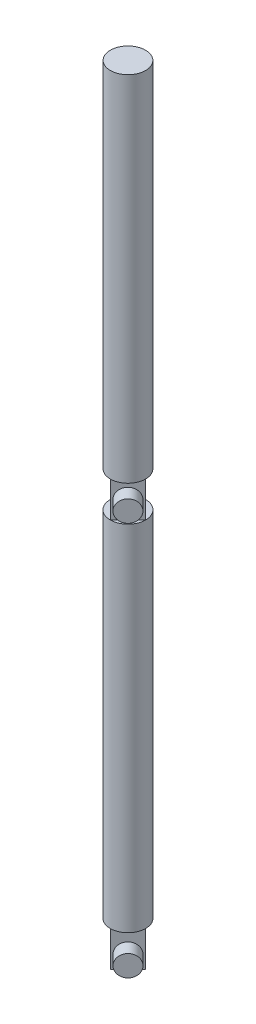
ISO-10303-21;
HEADER;
FILE_DESCRIPTION(('STEP AP214'),'2;1');
FILE_NAME('part.step','',(''),(''),'','','');
FILE_SCHEMA(('AUTOMOTIVE_DESIGN { 1 0 10303 214 1 1 1 1 }'));
ENDSEC;
DATA;
#1=APPLICATION_CONTEXT('core data for automotive mechanical design processes');
#2=APPLICATION_PROTOCOL_DEFINITION('international standard','automotive_design',2000,#1);
#3=PRODUCT_CONTEXT('',#1,'mechanical');
#4=PRODUCT('Part','Part','',(#3));
#5=PRODUCT_RELATED_PRODUCT_CATEGORY('part','',(#4));
#6=PRODUCT_DEFINITION_FORMATION('','',#4);
#7=PRODUCT_DEFINITION_CONTEXT('part definition',#1,'design');
#8=PRODUCT_DEFINITION('design','',#6,#7);
#9=PRODUCT_DEFINITION_SHAPE('','',#8);
#10=(LENGTH_UNIT() NAMED_UNIT(*) SI_UNIT(.MILLI.,.METRE.));
#11=(NAMED_UNIT(*) PLANE_ANGLE_UNIT() SI_UNIT($,.RADIAN.));
#12=(NAMED_UNIT(*) SI_UNIT($,.STERADIAN.) SOLID_ANGLE_UNIT());
#13=UNCERTAINTY_MEASURE_WITH_UNIT(LENGTH_MEASURE(1.E-05),#10,'distance_accuracy_value','');
#14=(GEOMETRIC_REPRESENTATION_CONTEXT(3) GLOBAL_UNCERTAINTY_ASSIGNED_CONTEXT((#13)) GLOBAL_UNIT_ASSIGNED_CONTEXT((#10,
#11,#12)) REPRESENTATION_CONTEXT('',''));
#15=CARTESIAN_POINT('',(0.,0.,0.));
#16=DIRECTION('',(0.,0.,1.));
#17=DIRECTION('',(1.,0.,0.));
#18=AXIS2_PLACEMENT_3D('',#15,#16,#17);
#19=CARTESIAN_POINT('',(0.,550.,0.));
#20=DIRECTION('',(0.,-1.,0.));
#21=DIRECTION('',(0.,0.,-1.));
#22=AXIS2_PLACEMENT_3D('',#19,#20,#21);
#23=PLANE('',#22);
#24=CARTESIAN_POINT('',(-21.9966057856953,550.,-2.2230612230224));
#25=DIRECTION('',(0.,1.,0.));
#26=DIRECTION('',(0.,0.,1.));
#27=AXIS2_PLACEMENT_3D('',#24,#25,#26);
#28=CIRCLE('',#27,24.8782014848427);
#29=CARTESIAN_POINT('',(2.88129607852289,550.,-2.10096308724056));
#30=VERTEX_POINT('',#29);
#31=CARTESIAN_POINT('',(2.88159534252092,550.,-2.22727363961716));
#32=VERTEX_POINT('',#31);
#33=EDGE_CURVE('E11',#30,#32,#28,.T.);
#34=ORIENTED_EDGE('',*,*,#33,.F.);
#35=DIRECTION('',(0.707106781186547,0.,-0.707106781186547));
#36=VECTOR('',#35,1.);
#37=CARTESIAN_POINT('',(-21.9966057856953,550.,22.7769387769776));
#38=LINE('',#37,#36);
#39=CARTESIAN_POINT('',(2.94460098671021,550.,-2.16426799542787));
#40=VERTEX_POINT('',#39);
#41=EDGE_CURVE('E156',#30,#40,#38,.T.);
#42=ORIENTED_EDGE('',*,*,#41,.T.);
#43=DIRECTION('',(-0.707106781186547,0.,-0.707106781186547));
#44=VECTOR('',#43,1.);
#45=CARTESIAN_POINT('',(-22.0553990132898,550.,-27.1642679954279));
#46=LINE('',#45,#44);
#47=EDGE_CURVE('E203',#40,#32,#46,.T.);
#48=ORIENTED_EDGE('',*,*,#47,.T.);
#49=EDGE_LOOP('',(#34,#42,#48));
#50=FACE_BOUND('',#49,.T.);
#51=ADVANCED_FACE('F39',(#50),#23,.F.);
#52=CARTESIAN_POINT('',(-21.9923933691005,550.,-27.1012623512386));
#53=VERTEX_POINT('',#52);
#54=CARTESIAN_POINT('',(-22.1187039214771,550.,-27.1009630872406));
#55=VERTEX_POINT('',#54);
#56=EDGE_CURVE('E48',#53,#55,#28,.T.);
#57=ORIENTED_EDGE('',*,*,#56,.F.);
#58=CARTESIAN_POINT('',(-22.0553990132898,550.,-27.1642679954279));
#59=VERTEX_POINT('',#58);
#60=EDGE_CURVE('E153',#53,#59,#46,.T.);
#61=ORIENTED_EDGE('',*,*,#60,.T.);
#62=DIRECTION('',(-0.707106781186547,0.,0.707106781186547));
#63=VECTOR('',#62,1.);
#64=CARTESIAN_POINT('',(-46.9966057856953,550.,-2.2230612230224));
#65=LINE('',#64,#63);
#66=EDGE_CURVE('E191',#59,#55,#65,.T.);
#67=ORIENTED_EDGE('',*,*,#66,.T.);
#68=EDGE_LOOP('',(#57,#61,#67));
#69=FACE_BOUND('',#68,.T.);
#70=ADVANCED_FACE('F342',(#69),#23,.F.);
#71=CARTESIAN_POINT('',(-46.8745076499134,550.,-2.34515935880425));
#72=VERTEX_POINT('',#71);
#73=CARTESIAN_POINT('',(-46.8745076499134,550.,-2.10096308724056));
#74=VERTEX_POINT('',#73);
#75=EDGE_CURVE('E172',#72,#74,#28,.T.);
#76=ORIENTED_EDGE('',*,*,#75,.F.);
#77=CARTESIAN_POINT('',(-46.9966057856953,550.,-2.2230612230224));
#78=VERTEX_POINT('',#77);
#79=EDGE_CURVE('E192',#72,#78,#65,.T.);
#80=ORIENTED_EDGE('',*,*,#79,.T.);
#81=DIRECTION('',(0.707106781186547,0.,0.707106781186547));
#82=VECTOR('',#81,1.);
#83=CARTESIAN_POINT('',(-46.9966057856953,550.,-2.2230612230224));
#84=LINE('',#83,#82);
#85=EDGE_CURVE('E199',#78,#74,#84,.T.);
#86=ORIENTED_EDGE('',*,*,#85,.T.);
#87=EDGE_LOOP('',(#76,#80,#86));
#88=FACE_BOUND('',#87,.T.);
#89=ADVANCED_FACE('F349',(#88),#23,.F.);
#90=CARTESIAN_POINT('',(-21.9966057856953,0.,-2.2230612230224));
#91=DIRECTION('',(0.,1.,0.));
#92=DIRECTION('',(0.,0.,1.));
#93=AXIS2_PLACEMENT_3D('',#90,#91,#92);
#94=PLANE('',#93);
#95=DIRECTION('',(-0.707106781186547,0.,0.707106781186548));
#96=VECTOR('',#95,1.);
#97=CARTESIAN_POINT('',(-21.9896594794857,0.,22.7838850831871));
#98=LINE('',#97,#96);
#99=CARTESIAN_POINT('',(3.00339035206428,0.,-2.20916474836285));
#100=VERTEX_POINT('',#99);
#101=CARTESIAN_POINT('',(-21.9827093110357,0.,22.7769349147371));
#102=VERTEX_POINT('',#101);
#103=EDGE_CURVE('E173',#100,#102,#98,.T.);
#104=ORIENTED_EDGE('',*,*,#103,.F.);
#105=CARTESIAN_POINT('',(-21.9966057856953,0.,-2.2230612230224));
#106=DIRECTION('',(0.,1.,0.));
#107=DIRECTION('',(0.,0.,1.));
#108=AXIS2_PLACEMENT_3D('',#105,#106,#107);
#109=CIRCLE('',#108,25.);
#110=EDGE_CURVE('E234',#102,#100,#109,.T.);
#111=ORIENTED_EDGE('',*,*,#110,.F.);
#112=EDGE_LOOP('',(#104,#111));
#113=FACE_BOUND('',#112,.T.);
#114=ADVANCED_FACE('F339',(#113),#94,.F.);
#115=DIRECTION('',(-0.707106781186548,0.,-0.707106781186547));
#116=VECTOR('',#115,1.);
#117=CARTESIAN_POINT('',(-46.9966057856953,0.,-2.22306122302241));
#118=LINE('',#117,#116);
#119=CARTESIAN_POINT('',(-21.9966057856952,0.,22.7769387769776));
#120=VERTEX_POINT('',#119);
#121=CARTESIAN_POINT('',(-46.9966057856953,0.,-2.22306122302239));
#122=VERTEX_POINT('',#121);
#123=EDGE_CURVE('E230',#120,#122,#118,.T.);
#124=ORIENTED_EDGE('',*,*,#123,.F.);
#125=EDGE_CURVE('E226',#122,#120,#109,.T.);
#126=ORIENTED_EDGE('',*,*,#125,.F.);
#127=EDGE_LOOP('',(#124,#126));
#128=FACE_BOUND('',#127,.T.);
#129=ADVANCED_FACE('F332',(#128),#94,.F.);
#130=DIRECTION('',(0.707106781186548,0.,0.707106781186547));
#131=VECTOR('',#130,1.);
#132=CARTESIAN_POINT('',(-21.9966057856953,0.,-27.2230612230224));
#133=LINE('',#132,#131);
#134=CARTESIAN_POINT('',(-21.9966057856953,0.,-27.2230612230224));
#135=VERTEX_POINT('',#134);
#136=CARTESIAN_POINT('',(3.00339421430474,0.,-2.22306122302241));
#137=VERTEX_POINT('',#136);
#138=EDGE_CURVE('E276',#135,#137,#133,.T.);
#139=ORIENTED_EDGE('',*,*,#138,.F.);
#140=EDGE_CURVE('E319',#137,#135,#109,.T.);
#141=ORIENTED_EDGE('',*,*,#140,.F.);
#142=EDGE_LOOP('',(#139,#141));
#143=FACE_BOUND('',#142,.T.);
#144=ADVANCED_FACE('F329',(#143),#94,.F.);
#145=DIRECTION('',(0.707106781186547,0.,-0.707106781186548));
#146=VECTOR('',#145,1.);
#147=CARTESIAN_POINT('',(-46.9966057856953,0.,-2.22306122302241));
#148=LINE('',#147,#146);
#149=EDGE_CURVE('E272',#122,#135,#148,.T.);
#150=ORIENTED_EDGE('',*,*,#149,.F.);
#151=EDGE_CURVE('E318',#135,#122,#109,.T.);
#152=ORIENTED_EDGE('',*,*,#151,.F.);
#153=EDGE_LOOP('',(#150,#152));
#154=FACE_BOUND('',#153,.T.);
#155=ADVANCED_FACE('F331',(#154),#94,.F.);
#156=CARTESIAN_POINT('',(-21.9966057856953,500.,-2.2230612230224));
#157=DIRECTION('',(0.,1.,0.));
#158=DIRECTION('',(0.,0.,1.));
#159=AXIS2_PLACEMENT_3D('',#156,#157,#158);
#160=PLANE('',#159);
#161=DIRECTION('',(-0.707106781186547,0.,0.707106781186547));
#162=VECTOR('',#161,1.);
#163=CARTESIAN_POINT('',(-46.9966057856953,500.,-2.2230612230224));
#164=LINE('',#163,#162);
#165=CARTESIAN_POINT('',(-22.0553990132898,500.,-27.1642679954279));
#166=VERTEX_POINT('',#165);
#167=CARTESIAN_POINT('',(-46.9966057856953,500.,-2.22306122302241));
#168=VERTEX_POINT('',#167);
#169=EDGE_CURVE('E206',#166,#168,#164,.T.);
#170=ORIENTED_EDGE('',*,*,#169,.F.);
#171=DIRECTION('',(-0.707106781186547,0.,-0.707106781186547));
#172=VECTOR('',#171,1.);
#173=CARTESIAN_POINT('',(-22.0553990132898,500.,-27.1642679954279));
#174=LINE('',#173,#172);
#175=CARTESIAN_POINT('',(2.94460098671021,500.,-2.16426799542787));
#176=VERTEX_POINT('',#175);
#177=EDGE_CURVE('E194',#176,#166,#174,.T.);
#178=ORIENTED_EDGE('',*,*,#177,.F.);
#179=DIRECTION('',(0.707106781186547,0.,-0.707106781186547));
#180=VECTOR('',#179,1.);
#181=CARTESIAN_POINT('',(-21.9966057856953,500.,22.7769387769776));
#182=LINE('',#181,#180);
#183=CARTESIAN_POINT('',(-21.9966057856953,500.,22.7769387769776));
#184=VERTEX_POINT('',#183);
#185=EDGE_CURVE('E212',#184,#176,#182,.T.);
#186=ORIENTED_EDGE('',*,*,#185,.F.);
#187=CARTESIAN_POINT('',(-21.9966057856953,500.,-2.2230612230224));
#188=DIRECTION('',(0.,1.,0.));
#189=DIRECTION('',(0.,0.,1.));
#190=AXIS2_PLACEMENT_3D('',#187,#188,#189);
#191=CIRCLE('',#190,25.);
#192=EDGE_CURVE('E227',#184,#168,#191,.T.);
#193=ORIENTED_EDGE('',*,*,#192,.T.);
#194=EDGE_LOOP('',(#170,#178,#186,#193));
#195=FACE_BOUND('',#194,.T.);
#196=ADVANCED_FACE('F337',(#195),#160,.T.);
#197=CARTESIAN_POINT('',(-21.9966057856953,500.,-2.2230612230224));
#198=DIRECTION('',(0.,-1.,0.));
#199=DIRECTION('',(0.,0.,-1.));
#200=AXIS2_PLACEMENT_3D('',#197,#198,#199);
#201=CYLINDRICAL_SURFACE('',#200,25.);
#202=ORIENTED_EDGE('',*,*,#192,.F.);
#203=EDGE_CURVE('E231',#168,#184,#191,.T.);
#204=ORIENTED_EDGE('',*,*,#203,.F.);
#205=EDGE_LOOP('',(#202,#204));
#206=FACE_BOUND('',#205,.T.);
#207=EDGE_CURVE('E232',#120,#102,#109,.T.);
#208=ORIENTED_EDGE('',*,*,#207,.T.);
#209=ORIENTED_EDGE('',*,*,#110,.T.);
#210=EDGE_CURVE('E320',#100,#137,#109,.T.);
#211=ORIENTED_EDGE('',*,*,#210,.T.);
#212=ORIENTED_EDGE('',*,*,#140,.T.);
#213=ORIENTED_EDGE('',*,*,#151,.T.);
#214=ORIENTED_EDGE('',*,*,#125,.T.);
#215=EDGE_LOOP('',(#208,#209,#211,#212,#213,#214));
#216=FACE_BOUND('',#215,.T.);
#217=ADVANCED_FACE('F41',(#206,#216),#201,.T.);
#218=DIRECTION('',(0.707106781186547,0.,0.707106781186547));
#219=VECTOR('',#218,1.);
#220=CARTESIAN_POINT('',(-46.9966057856953,500.,-2.2230612230224));
#221=LINE('',#220,#219);
#222=EDGE_CURVE('E209',#168,#184,#221,.T.);
#223=ORIENTED_EDGE('',*,*,#222,.F.);
#224=ORIENTED_EDGE('',*,*,#203,.T.);
#225=EDGE_LOOP('',(#223,#224));
#226=FACE_BOUND('',#225,.T.);
#227=ADVANCED_FACE('F439',(#226),#160,.T.);
#228=CARTESIAN_POINT('',(-46.9966057856953,550.,-2.2230612230224));
#229=DIRECTION('',(0.707106781186547,0.,0.707106781186547));
#230=DIRECTION('',(0.707106781186548,0.,-0.707106781186548));
#231=AXIS2_PLACEMENT_3D('',#228,#229,#230);
#232=PLANE('',#231);
#233=CARTESIAN_POINT('',(-34.5260023994925,525.,-14.6936646092251));
#234=DIRECTION('',(0.707106781186547,0.,0.707106781186547));
#235=DIRECTION('',(0.707106781186548,0.,-0.707106781186548));
#236=AXIS2_PLACEMENT_3D('',#233,#234,#235);
#237=CIRCLE('',#236,15.);
#238=CARTESIAN_POINT('',(-23.9194006816943,525.,-25.3002663270233));
#239=VERTEX_POINT('',#238);
#240=EDGE_CURVE('E255',#239,#239,#237,.T.);
#241=ORIENTED_EDGE('',*,*,#240,.T.);
#242=EDGE_LOOP('',(#241));
#243=FACE_BOUND('',#242,.T.);
#244=ORIENTED_EDGE('',*,*,#169,.T.);
#245=DIRECTION('',(0.,-1.,0.));
#246=VECTOR('',#245,1.);
#247=CARTESIAN_POINT('',(-46.9966057856953,550.,-2.2230612230224));
#248=LINE('',#247,#246);
#249=EDGE_CURVE('E223',#78,#168,#248,.T.);
#250=ORIENTED_EDGE('',*,*,#249,.F.);
#251=ORIENTED_EDGE('',*,*,#79,.F.);
#252=EDGE_CURVE('E187',#55,#72,#65,.T.);
#253=ORIENTED_EDGE('',*,*,#252,.F.);
#254=ORIENTED_EDGE('',*,*,#66,.F.);
#255=DIRECTION('',(0.,-1.,0.));
#256=VECTOR('',#255,1.);
#257=CARTESIAN_POINT('',(-22.0553990132898,550.,-27.1642679954279));
#258=LINE('',#257,#256);
#259=EDGE_CURVE('E205',#59,#166,#258,.T.);
#260=ORIENTED_EDGE('',*,*,#259,.T.);
#261=EDGE_LOOP('',(#244,#250,#251,#253,#254,#260));
#262=FACE_BOUND('',#261,.T.);
#263=ADVANCED_FACE('F369',(#243,#262),#232,.F.);
#264=CARTESIAN_POINT('',(-46.9966057856953,550.,-2.2230612230224));
#265=DIRECTION('',(0.707106781186547,0.,-0.707106781186547));
#266=DIRECTION('',(-0.707106781186548,0.,-0.707106781186548));
#267=AXIS2_PLACEMENT_3D('',#264,#265,#266);
#268=PLANE('',#267);
#269=ORIENTED_EDGE('',*,*,#222,.T.);
#270=DIRECTION('',(0.,-1.,0.));
#271=VECTOR('',#270,1.);
#272=CARTESIAN_POINT('',(-21.9966057856953,550.,22.7769387769776));
#273=LINE('',#272,#271);
#274=CARTESIAN_POINT('',(-21.9966057856953,550.,22.7769387769776));
#275=VERTEX_POINT('',#274);
#276=EDGE_CURVE('E221',#275,#184,#273,.T.);
#277=ORIENTED_EDGE('',*,*,#276,.F.);
#278=CARTESIAN_POINT('',(-22.1187039214771,550.,22.6548406411957));
#279=VERTEX_POINT('',#278);
#280=EDGE_CURVE('E149',#279,#275,#84,.T.);
#281=ORIENTED_EDGE('',*,*,#280,.F.);
#282=EDGE_CURVE('E201',#74,#279,#84,.T.);
#283=ORIENTED_EDGE('',*,*,#282,.F.);
#284=ORIENTED_EDGE('',*,*,#85,.F.);
#285=ORIENTED_EDGE('',*,*,#249,.T.);
#286=EDGE_LOOP('',(#269,#277,#281,#283,#284,#285));
#287=FACE_BOUND('',#286,.T.);
#288=ADVANCED_FACE('F371',(#287),#268,.F.);
#289=CARTESIAN_POINT('',(-21.9966057856953,550.,22.7769387769776));
#290=DIRECTION('',(-0.707106781186547,0.,-0.707106781186547));
#291=DIRECTION('',(-0.707106781186548,0.,0.707106781186548));
#292=AXIS2_PLACEMENT_3D('',#289,#290,#291);
#293=PLANE('',#292);
#294=CARTESIAN_POINT('',(-9.52600239949253,525.,10.3063353907749));
#295=DIRECTION('',(-0.707106781186547,0.,-0.707106781186547));
#296=DIRECTION('',(-0.707106781186548,0.,0.707106781186548));
#297=AXIS2_PLACEMENT_3D('',#294,#295,#296);
#298=CIRCLE('',#297,15.);
#299=CARTESIAN_POINT('',(-20.1326041172907,525.,20.9129371085731));
#300=VERTEX_POINT('',#299);
#301=EDGE_CURVE('E43',#300,#300,#298,.T.);
#302=ORIENTED_EDGE('',*,*,#301,.T.);
#303=EDGE_LOOP('',(#302));
#304=FACE_BOUND('',#303,.T.);
#305=ORIENTED_EDGE('',*,*,#185,.T.);
#306=DIRECTION('',(0.,-1.,0.));
#307=VECTOR('',#306,1.);
#308=CARTESIAN_POINT('',(2.94460098671021,550.,-2.16426799542787));
#309=LINE('',#308,#307);
#310=EDGE_CURVE('E218',#40,#176,#309,.T.);
#311=ORIENTED_EDGE('',*,*,#310,.F.);
#312=ORIENTED_EDGE('',*,*,#41,.F.);
#313=CARTESIAN_POINT('',(-21.8745076499134,550.,22.6548406411957));
#314=VERTEX_POINT('',#313);
#315=EDGE_CURVE('E154',#314,#30,#38,.T.);
#316=ORIENTED_EDGE('',*,*,#315,.F.);
#317=EDGE_CURVE('E143',#275,#314,#38,.T.);
#318=ORIENTED_EDGE('',*,*,#317,.F.);
#319=ORIENTED_EDGE('',*,*,#276,.T.);
#320=EDGE_LOOP('',(#305,#311,#312,#316,#318,#319));
#321=FACE_BOUND('',#320,.T.);
#322=ADVANCED_FACE('F160',(#304,#321),#293,.F.);
#323=CARTESIAN_POINT('',(-22.0553990132898,550.,-27.1642679954279));
#324=DIRECTION('',(-0.707106781186547,0.,0.707106781186547));
#325=DIRECTION('',(0.707106781186548,0.,0.707106781186548));
#326=AXIS2_PLACEMENT_3D('',#323,#324,#325);
#327=PLANE('',#326);
#328=ORIENTED_EDGE('',*,*,#177,.T.);
#329=ORIENTED_EDGE('',*,*,#259,.F.);
#330=ORIENTED_EDGE('',*,*,#60,.F.);
#331=EDGE_CURVE('E63',#32,#53,#46,.T.);
#332=ORIENTED_EDGE('',*,*,#331,.F.);
#333=ORIENTED_EDGE('',*,*,#47,.F.);
#334=ORIENTED_EDGE('',*,*,#310,.T.);
#335=EDGE_LOOP('',(#328,#329,#330,#332,#333,#334));
#336=FACE_BOUND('',#335,.T.);
#337=ADVANCED_FACE('F353',(#336),#327,.F.);
#338=EDGE_CURVE('E147',#279,#314,#28,.T.);
#339=ORIENTED_EDGE('',*,*,#338,.F.);
#340=ORIENTED_EDGE('',*,*,#280,.T.);
#341=ORIENTED_EDGE('',*,*,#317,.T.);
#342=EDGE_LOOP('',(#339,#340,#341));
#343=FACE_BOUND('',#342,.T.);
#344=ADVANCED_FACE('F145',(#343),#23,.F.);
#345=CARTESIAN_POINT('',(0.,0.,0.));
#346=DIRECTION('',(0.,1.,0.));
#347=DIRECTION('',(0.,0.,1.));
#348=AXIS2_PLACEMENT_3D('',#345,#346,#347);
#349=PLANE('',#348);
#350=ORIENTED_EDGE('',*,*,#207,.F.);
#351=CARTESIAN_POINT('',(-21.9896594794857,0.,22.7838850831871));
#352=VERTEX_POINT('',#351);
#353=EDGE_CURVE('E258',#352,#120,#118,.T.);
#354=ORIENTED_EDGE('',*,*,#353,.F.);
#355=EDGE_CURVE('E279',#102,#352,#98,.T.);
#356=ORIENTED_EDGE('',*,*,#355,.F.);
#357=EDGE_LOOP('',(#350,#354,#356));
#358=FACE_BOUND('',#357,.T.);
#359=ADVANCED_FACE('F311',(#358),#349,.T.);
#360=ORIENTED_EDGE('',*,*,#210,.F.);
#361=CARTESIAN_POINT('',(3.0103405205143,0.,-2.21611491681286));
#362=VERTEX_POINT('',#361);
#363=EDGE_CURVE('E263',#362,#100,#98,.T.);
#364=ORIENTED_EDGE('',*,*,#363,.F.);
#365=EDGE_CURVE('E275',#137,#362,#133,.T.);
#366=ORIENTED_EDGE('',*,*,#365,.F.);
#367=EDGE_LOOP('',(#360,#364,#366));
#368=FACE_BOUND('',#367,.T.);
#369=ADVANCED_FACE('F324',(#368),#349,.T.);
#370=CARTESIAN_POINT('',(-46.9966057856953,-50.,-2.22306122302241));
#371=DIRECTION('',(0.707106781186547,0.,-0.707106781186548));
#372=DIRECTION('',(-0.707106781186548,0.,-0.707106781186547));
#373=AXIS2_PLACEMENT_3D('',#370,#371,#372);
#374=PLANE('',#373);
#375=ORIENTED_EDGE('',*,*,#353,.T.);
#376=ORIENTED_EDGE('',*,*,#123,.T.);
#377=DIRECTION('',(0.,1.,0.));
#378=VECTOR('',#377,1.);
#379=CARTESIAN_POINT('',(-46.9966057856953,-50.,-2.22306122302241));
#380=LINE('',#379,#378);
#381=CARTESIAN_POINT('',(-46.9966057856953,-50.,-2.22306122302241));
#382=VERTEX_POINT('',#381);
#383=EDGE_CURVE('E197',#382,#122,#380,.T.);
#384=ORIENTED_EDGE('',*,*,#383,.F.);
#385=DIRECTION('',(-0.707106781186548,0.,-0.707106781186547));
#386=VECTOR('',#385,1.);
#387=CARTESIAN_POINT('',(-46.9966057856953,-50.,-2.22306122302241));
#388=LINE('',#387,#386);
#389=CARTESIAN_POINT('',(-21.9896594794857,-50.,22.7838850831871));
#390=VERTEX_POINT('',#389);
#391=EDGE_CURVE('E259',#390,#382,#388,.T.);
#392=ORIENTED_EDGE('',*,*,#391,.F.);
#393=DIRECTION('',(0.,1.,0.));
#394=VECTOR('',#393,1.);
#395=CARTESIAN_POINT('',(-21.9896594794857,-50.,22.7838850831871));
#396=LINE('',#395,#394);
#397=EDGE_CURVE('E269',#390,#352,#396,.T.);
#398=ORIENTED_EDGE('',*,*,#397,.T.);
#399=EDGE_LOOP('',(#375,#376,#384,#392,#398));
#400=FACE_BOUND('',#399,.T.);
#401=ADVANCED_FACE('F298',(#400),#374,.F.);
#402=CARTESIAN_POINT('',(-46.9966057856953,-50.,-2.22306122302241));
#403=DIRECTION('',(0.707106781186548,0.,0.707106781186547));
#404=DIRECTION('',(0.707106781186547,0.,-0.707106781186548));
#405=AXIS2_PLACEMENT_3D('',#402,#403,#404);
#406=PLANE('',#405);
#407=CARTESIAN_POINT('',(-34.4962637160924,-31.3999984105153,-14.7234032926253));
#408=DIRECTION('',(0.707106781186548,0.,0.707106781186547));
#409=DIRECTION('',(0.707106781186547,0.,-0.707106781186548));
#410=AXIS2_PLACEMENT_3D('',#407,#408,#409);
#411=CIRCLE('',#410,15.);
#412=CARTESIAN_POINT('',(-23.8896619982942,-31.3999984105153,-25.3300050104235));
#413=VERTEX_POINT('',#412);
#414=EDGE_CURVE('E237',#413,#413,#411,.T.);
#415=ORIENTED_EDGE('',*,*,#414,.T.);
#416=EDGE_LOOP('',(#415));
#417=FACE_BOUND('',#416,.T.);
#418=ORIENTED_EDGE('',*,*,#149,.T.);
#419=DIRECTION('',(0.,1.,0.));
#420=VECTOR('',#419,1.);
#421=CARTESIAN_POINT('',(-21.9966057856953,-50.,-27.2230612230224));
#422=LINE('',#421,#420);
#423=CARTESIAN_POINT('',(-21.9966057856953,-50.,-27.2230612230224));
#424=VERTEX_POINT('',#423);
#425=EDGE_CURVE('E286',#424,#135,#422,.T.);
#426=ORIENTED_EDGE('',*,*,#425,.F.);
#427=DIRECTION('',(0.707106781186547,0.,-0.707106781186548));
#428=VECTOR('',#427,1.);
#429=CARTESIAN_POINT('',(-46.9966057856953,-50.,-2.22306122302241));
#430=LINE('',#429,#428);
#431=EDGE_CURVE('E262',#382,#424,#430,.T.);
#432=ORIENTED_EDGE('',*,*,#431,.F.);
#433=ORIENTED_EDGE('',*,*,#383,.T.);
#434=EDGE_LOOP('',(#418,#426,#432,#433));
#435=FACE_BOUND('',#434,.T.);
#436=ADVANCED_FACE('F294',(#417,#435),#406,.F.);
#437=CARTESIAN_POINT('',(-21.9966057856953,-50.,-27.2230612230224));
#438=DIRECTION('',(-0.707106781186547,0.,0.707106781186548));
#439=DIRECTION('',(0.707106781186548,0.,0.707106781186547));
#440=AXIS2_PLACEMENT_3D('',#437,#438,#439);
#441=PLANE('',#440);
#442=ORIENTED_EDGE('',*,*,#138,.T.);
#443=ORIENTED_EDGE('',*,*,#365,.T.);
#444=DIRECTION('',(0.,1.,0.));
#445=VECTOR('',#444,1.);
#446=CARTESIAN_POINT('',(3.0103405205143,-50.,-2.21611491681286));
#447=LINE('',#446,#445);
#448=CARTESIAN_POINT('',(3.0103405205143,-50.,-2.21611491681286));
#449=VERTEX_POINT('',#448);
#450=EDGE_CURVE('E284',#449,#362,#447,.T.);
#451=ORIENTED_EDGE('',*,*,#450,.F.);
#452=DIRECTION('',(0.707106781186548,0.,0.707106781186547));
#453=VECTOR('',#452,1.);
#454=CARTESIAN_POINT('',(-21.9966057856953,-50.,-27.2230612230224));
#455=LINE('',#454,#453);
#456=EDGE_CURVE('E265',#424,#449,#455,.T.);
#457=ORIENTED_EDGE('',*,*,#456,.F.);
#458=ORIENTED_EDGE('',*,*,#425,.T.);
#459=EDGE_LOOP('',(#442,#443,#451,#457,#458));
#460=FACE_BOUND('',#459,.T.);
#461=ADVANCED_FACE('F327',(#460),#441,.F.);
#462=CARTESIAN_POINT('',(-21.9896594794857,-50.,22.7838850831871));
#463=DIRECTION('',(-0.707106781186548,0.,-0.707106781186547));
#464=DIRECTION('',(-0.707106781186547,0.,0.707106781186548));
#465=AXIS2_PLACEMENT_3D('',#462,#463,#464);
#466=PLANE('',#465);
#467=CARTESIAN_POINT('',(-9.48931740988284,-31.3999984105153,10.2835430135843));
#468=DIRECTION('',(-0.707106781186548,0.,-0.707106781186547));
#469=DIRECTION('',(-0.707106781186547,0.,0.707106781186548));
#470=AXIS2_PLACEMENT_3D('',#467,#468,#469);
#471=CIRCLE('',#470,15.);
#472=CARTESIAN_POINT('',(-20.0959191276811,-31.3999984105153,20.8901447313825));
#473=VERTEX_POINT('',#472);
#474=EDGE_CURVE('E235',#473,#473,#471,.T.);
#475=ORIENTED_EDGE('',*,*,#474,.T.);
#476=EDGE_LOOP('',(#475));
#477=FACE_BOUND('',#476,.T.);
#478=ORIENTED_EDGE('',*,*,#363,.T.);
#479=ORIENTED_EDGE('',*,*,#103,.T.);
#480=ORIENTED_EDGE('',*,*,#355,.T.);
#481=ORIENTED_EDGE('',*,*,#397,.F.);
#482=DIRECTION('',(-0.707106781186547,0.,0.707106781186548));
#483=VECTOR('',#482,1.);
#484=CARTESIAN_POINT('',(-21.9896594794857,-50.,22.7838850831871));
#485=LINE('',#484,#483);
#486=EDGE_CURVE('E267',#449,#390,#485,.T.);
#487=ORIENTED_EDGE('',*,*,#486,.F.);
#488=ORIENTED_EDGE('',*,*,#450,.T.);
#489=EDGE_LOOP('',(#478,#479,#480,#481,#487,#488));
#490=FACE_BOUND('',#489,.T.);
#491=ADVANCED_FACE('F307',(#477,#490),#466,.F.);
#492=CARTESIAN_POINT('',(0.,-50.,0.));
#493=DIRECTION('',(0.,1.,0.));
#494=DIRECTION('',(0.,0.,1.));
#495=AXIS2_PLACEMENT_3D('',#492,#493,#494);
#496=PLANE('',#495);
#497=ORIENTED_EDGE('',*,*,#391,.T.);
#498=ORIENTED_EDGE('',*,*,#431,.T.);
#499=ORIENTED_EDGE('',*,*,#456,.T.);
#500=ORIENTED_EDGE('',*,*,#486,.T.);
#501=EDGE_LOOP('',(#497,#498,#499,#500));
#502=FACE_BOUND('',#501,.T.);
#503=ADVANCED_FACE('F392',(#502),#496,.F.);
#504=CARTESIAN_POINT('',(4.65281821384812,-31.3999984105153,24.4256786373152));
#505=DIRECTION('',(0.707106781186548,0.,0.707106781186547));
#506=DIRECTION('',(0.707106781186547,0.,-0.707106781186548));
#507=AXIS2_PLACEMENT_3D('',#504,#505,#506);
#508=PLANE('',#507);
#509=CARTESIAN_POINT('',(4.65281821384812,-31.3999984105153,24.4256786373152));
#510=DIRECTION('',(0.707106781186548,0.,0.707106781186547));
#511=DIRECTION('',(0.707106781186547,0.,-0.707106781186548));
#512=AXIS2_PLACEMENT_3D('',#509,#510,#511);
#513=CIRCLE('',#512,15.);
#514=CARTESIAN_POINT('',(15.2594199316463,-31.3999984105153,13.819076919517));
#515=VERTEX_POINT('',#514);
#516=EDGE_CURVE('E244',#515,#515,#513,.T.);
#517=ORIENTED_EDGE('',*,*,#516,.T.);
#518=EDGE_LOOP('',(#517));
#519=FACE_BOUND('',#518,.T.);
#520=ADVANCED_FACE('F388',(#519),#508,.T.);
#521=CARTESIAN_POINT('',(-48.6630330876176,-31.3999984105153,-28.8901726641504));
#522=DIRECTION('',(0.707106781186548,0.,0.707106781186547));
#523=DIRECTION('',(0.707106781186547,0.,-0.707106781186548));
#524=AXIS2_PLACEMENT_3D('',#521,#522,#523);
#525=CYLINDRICAL_SURFACE('',#524,15.);
#526=ORIENTED_EDGE('',*,*,#516,.F.);
#527=EDGE_LOOP('',(#526));
#528=FACE_BOUND('',#527,.T.);
#529=ORIENTED_EDGE('',*,*,#474,.F.);
#530=EDGE_LOOP('',(#529));
#531=FACE_BOUND('',#530,.T.);
#532=ADVANCED_FACE('F391',(#528,#531),#525,.T.);
#533=CARTESIAN_POINT('',(-48.6630330876176,-31.3999984105153,-28.8901726641504));
#534=DIRECTION('',(0.707106781186548,0.,0.707106781186547));
#535=DIRECTION('',(0.707106781186547,0.,-0.707106781186548));
#536=AXIS2_PLACEMENT_3D('',#533,#534,#535);
#537=CIRCLE('',#536,15.);
#538=CARTESIAN_POINT('',(-38.0564313698194,-31.3999984105153,-39.4967743819487));
#539=VERTEX_POINT('',#538);
#540=EDGE_CURVE('E238',#539,#539,#537,.T.);
#541=ORIENTED_EDGE('',*,*,#540,.T.);
#542=EDGE_LOOP('',(#541));
#543=FACE_BOUND('',#542,.T.);
#544=ORIENTED_EDGE('',*,*,#414,.F.);
#545=EDGE_LOOP('',(#544));
#546=FACE_BOUND('',#545,.T.);
#547=ADVANCED_FACE('F398',(#543,#546),#525,.T.);
#548=CARTESIAN_POINT('',(-48.6630330876176,-31.3999984105153,-28.8901726641504));
#549=DIRECTION('',(0.707106781186548,0.,0.707106781186547));
#550=DIRECTION('',(0.707106781186547,0.,-0.707106781186548));
#551=AXIS2_PLACEMENT_3D('',#548,#549,#550);
#552=PLANE('',#551);
#553=ORIENTED_EDGE('',*,*,#540,.F.);
#554=EDGE_LOOP('',(#553));
#555=FACE_BOUND('',#554,.T.);
#556=ADVANCED_FACE('F394',(#555),#552,.F.);
#557=CARTESIAN_POINT('',(4.62307953044797,525.,24.4554173207154));
#558=DIRECTION('',(0.707106781186548,0.,0.707106781186547));
#559=DIRECTION('',(0.707106781186547,0.,-0.707106781186548));
#560=AXIS2_PLACEMENT_3D('',#557,#558,#559);
#561=PLANE('',#560);
#562=CARTESIAN_POINT('',(4.62307953044797,525.,24.4554173207154));
#563=DIRECTION('',(0.707106781186548,0.,0.707106781186547));
#564=DIRECTION('',(0.707106781186547,0.,-0.707106781186548));
#565=AXIS2_PLACEMENT_3D('',#562,#563,#564);
#566=CIRCLE('',#565,15.);
#567=CARTESIAN_POINT('',(15.2296812482462,525.,13.8488156029171));
#568=VERTEX_POINT('',#567);
#569=EDGE_CURVE('E249',#568,#568,#566,.T.);
#570=ORIENTED_EDGE('',*,*,#569,.T.);
#571=EDGE_LOOP('',(#570));
#572=FACE_BOUND('',#571,.T.);
#573=ADVANCED_FACE('F397',(#572),#561,.T.);
#574=CARTESIAN_POINT('',(-48.6927717710177,525.,-28.8604339807503));
#575=DIRECTION('',(0.707106781186548,0.,0.707106781186547));
#576=DIRECTION('',(0.707106781186547,0.,-0.707106781186548));
#577=AXIS2_PLACEMENT_3D('',#574,#575,#576);
#578=CYLINDRICAL_SURFACE('',#577,15.);
#579=ORIENTED_EDGE('',*,*,#569,.F.);
#580=EDGE_LOOP('',(#579));
#581=FACE_BOUND('',#580,.T.);
#582=ORIENTED_EDGE('',*,*,#301,.F.);
#583=EDGE_LOOP('',(#582));
#584=FACE_BOUND('',#583,.T.);
#585=ADVANCED_FACE('F405',(#581,#584),#578,.T.);
#586=CARTESIAN_POINT('',(-48.6927717710177,525.,-28.8604339807503));
#587=DIRECTION('',(0.707106781186548,0.,0.707106781186547));
#588=DIRECTION('',(0.707106781186547,0.,-0.707106781186548));
#589=AXIS2_PLACEMENT_3D('',#586,#587,#588);
#590=CIRCLE('',#589,15.);
#591=CARTESIAN_POINT('',(-38.0861700532195,525.,-39.4670356985485));
#592=VERTEX_POINT('',#591);
#593=EDGE_CURVE('E177',#592,#592,#590,.T.);
#594=ORIENTED_EDGE('',*,*,#593,.T.);
#595=EDGE_LOOP('',(#594));
#596=FACE_BOUND('',#595,.T.);
#597=ORIENTED_EDGE('',*,*,#240,.F.);
#598=EDGE_LOOP('',(#597));
#599=FACE_BOUND('',#598,.T.);
#600=ADVANCED_FACE('F402',(#596,#599),#578,.T.);
#601=CARTESIAN_POINT('',(-48.6927717710177,525.,-28.8604339807503));
#602=DIRECTION('',(0.707106781186548,0.,0.707106781186547));
#603=DIRECTION('',(0.707106781186547,0.,-0.707106781186548));
#604=AXIS2_PLACEMENT_3D('',#601,#602,#603);
#605=PLANE('',#604);
#606=ORIENTED_EDGE('',*,*,#593,.F.);
#607=EDGE_LOOP('',(#606));
#608=FACE_BOUND('',#607,.T.);
#609=ADVANCED_FACE('F381',(#608),#605,.F.);
#610=CARTESIAN_POINT('',(-21.9966057856953,550.,-2.2230612230224));
#611=DIRECTION('',(0.,1.,0.));
#612=DIRECTION('',(0.,0.,1.));
#613=AXIS2_PLACEMENT_3D('',#610,#611,#612);
#614=PLANE('',#613);
#615=EDGE_CURVE('E180',#55,#72,#28,.T.);
#616=ORIENTED_EDGE('',*,*,#615,.F.);
#617=ORIENTED_EDGE('',*,*,#252,.T.);
#618=EDGE_LOOP('',(#616,#617));
#619=FACE_BOUND('',#618,.T.);
#620=ADVANCED_FACE('F186',(#619),#614,.F.);
#621=EDGE_CURVE('E171',#74,#279,#28,.T.);
#622=ORIENTED_EDGE('',*,*,#621,.F.);
#623=ORIENTED_EDGE('',*,*,#282,.T.);
#624=EDGE_LOOP('',(#622,#623));
#625=FACE_BOUND('',#624,.T.);
#626=ADVANCED_FACE('F374',(#625),#614,.F.);
#627=EDGE_CURVE('E168',#314,#30,#28,.T.);
#628=ORIENTED_EDGE('',*,*,#627,.F.);
#629=ORIENTED_EDGE('',*,*,#315,.T.);
#630=EDGE_LOOP('',(#628,#629));
#631=FACE_BOUND('',#630,.T.);
#632=ADVANCED_FACE('F174',(#631),#614,.F.);
#633=EDGE_CURVE('E50',#32,#53,#28,.T.);
#634=ORIENTED_EDGE('',*,*,#633,.F.);
#635=ORIENTED_EDGE('',*,*,#331,.T.);
#636=EDGE_LOOP('',(#634,#635));
#637=FACE_BOUND('',#636,.T.);
#638=ADVANCED_FACE('F380',(#637),#614,.F.);
#639=CARTESIAN_POINT('',(-21.9966057856953,1050.,-2.2230612230224));
#640=DIRECTION('',(0.,-1.,0.));
#641=DIRECTION('',(0.,0.,-1.));
#642=AXIS2_PLACEMENT_3D('',#639,#640,#641);
#643=CYLINDRICAL_SURFACE('',#642,24.8782014848427);
#644=CARTESIAN_POINT('',(-21.9966057856953,1050.,-2.2230612230224));
#645=DIRECTION('',(0.,1.,0.));
#646=DIRECTION('',(0.,0.,1.));
#647=AXIS2_PLACEMENT_3D('',#644,#645,#646);
#648=CIRCLE('',#647,24.8782014848427);
#649=CARTESIAN_POINT('',(-21.9966057856953,1050.,22.6551402618203));
#650=VERTEX_POINT('',#649);
#651=EDGE_CURVE('E175',#650,#650,#648,.T.);
#652=ORIENTED_EDGE('',*,*,#651,.F.);
#653=EDGE_LOOP('',(#652));
#654=FACE_BOUND('',#653,.T.);
#655=ORIENTED_EDGE('',*,*,#627,.T.);
#656=ORIENTED_EDGE('',*,*,#33,.T.);
#657=ORIENTED_EDGE('',*,*,#633,.T.);
#658=ORIENTED_EDGE('',*,*,#56,.T.);
#659=ORIENTED_EDGE('',*,*,#615,.T.);
#660=ORIENTED_EDGE('',*,*,#75,.T.);
#661=ORIENTED_EDGE('',*,*,#621,.T.);
#662=ORIENTED_EDGE('',*,*,#338,.T.);
#663=EDGE_LOOP('',(#655,#656,#657,#658,#659,#660,#661,#662));
#664=FACE_BOUND('',#663,.T.);
#665=ADVANCED_FACE('F167',(#654,#664),#643,.T.);
#666=CARTESIAN_POINT('',(-21.9966057856953,1050.,-2.2230612230224));
#667=DIRECTION('',(0.,1.,0.));
#668=DIRECTION('',(0.,0.,1.));
#669=AXIS2_PLACEMENT_3D('',#666,#667,#668);
#670=PLANE('',#669);
#671=ORIENTED_EDGE('',*,*,#651,.T.);
#672=EDGE_LOOP('',(#671));
#673=FACE_BOUND('',#672,.T.);
#674=ADVANCED_FACE('F384',(#673),#670,.T.);
#675=CLOSED_SHELL('',(#51,#70,#89,#114,#129,#144,#155,#196,#217,#227,#263,#288,#322,#337,#344,
#359,#369,#401,#436,#461,#491,#503,#520,#532,#547,#556,#573,#585,#600,#609,#620,#626,#632,#638,
#665,#674));
#676=MANIFOLD_SOLID_BREP('B2',#675);
#677=ADVANCED_BREP_SHAPE_REPRESENTATION('',(#18,#676),#14);
#678=SHAPE_DEFINITION_REPRESENTATION(#9,#677);
ENDSEC;
END-ISO-10303-21;
